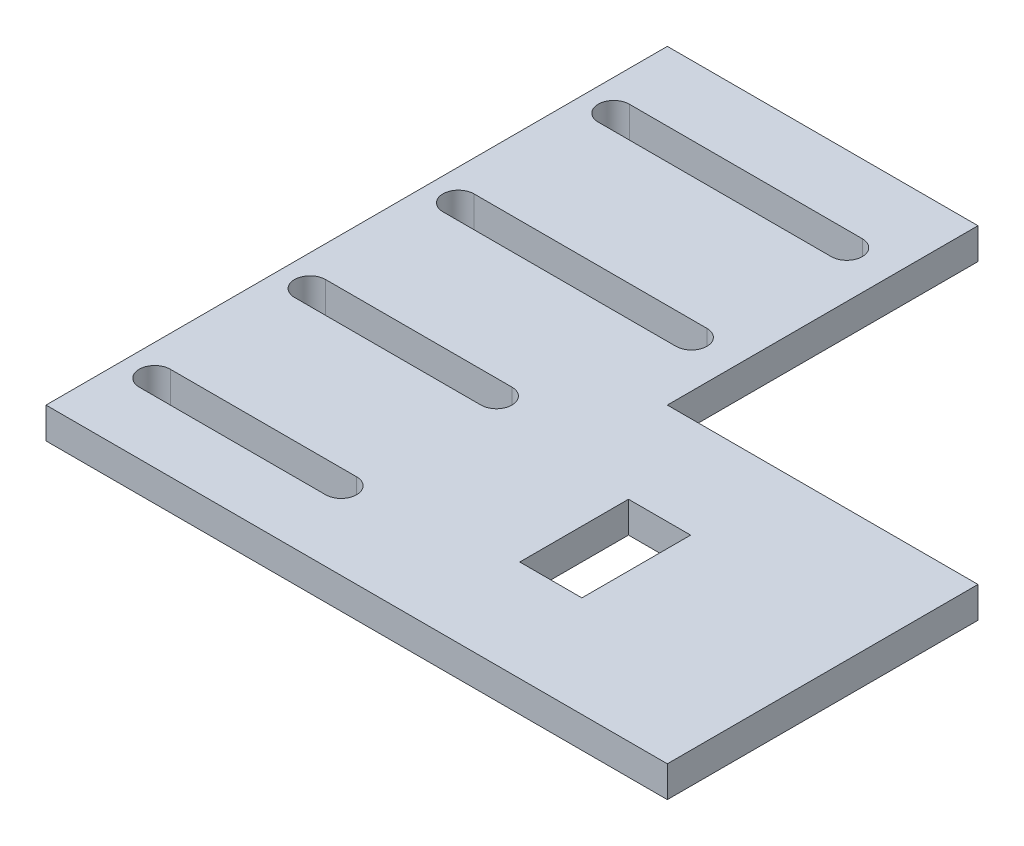
ISO-10303-21;
HEADER;
FILE_DESCRIPTION(('STEP AP214'),'2;1');
FILE_NAME('part.step','',(''),(''),'','','');
FILE_SCHEMA(('AUTOMOTIVE_DESIGN { 1 0 10303 214 1 1 1 1 }'));
ENDSEC;
DATA;
#1=APPLICATION_CONTEXT('core data for automotive mechanical design processes');
#2=APPLICATION_PROTOCOL_DEFINITION('international standard','automotive_design',2000,#1);
#3=PRODUCT_CONTEXT('',#1,'mechanical');
#4=PRODUCT('Part','Part','',(#3));
#5=PRODUCT_RELATED_PRODUCT_CATEGORY('part','',(#4));
#6=PRODUCT_DEFINITION_FORMATION('','',#4);
#7=PRODUCT_DEFINITION_CONTEXT('part definition',#1,'design');
#8=PRODUCT_DEFINITION('design','',#6,#7);
#9=PRODUCT_DEFINITION_SHAPE('','',#8);
#10=(LENGTH_UNIT() NAMED_UNIT(*) SI_UNIT(.MILLI.,.METRE.));
#11=(NAMED_UNIT(*) PLANE_ANGLE_UNIT() SI_UNIT($,.RADIAN.));
#12=(NAMED_UNIT(*) SI_UNIT($,.STERADIAN.) SOLID_ANGLE_UNIT());
#13=UNCERTAINTY_MEASURE_WITH_UNIT(LENGTH_MEASURE(1.E-05),#10,'distance_accuracy_value','');
#14=(GEOMETRIC_REPRESENTATION_CONTEXT(3) GLOBAL_UNCERTAINTY_ASSIGNED_CONTEXT((#13)) GLOBAL_UNIT_ASSIGNED_CONTEXT((#10,
#11,#12)) REPRESENTATION_CONTEXT('',''));
#15=CARTESIAN_POINT('',(0.,0.,0.));
#16=DIRECTION('',(0.,0.,1.));
#17=DIRECTION('',(1.,0.,0.));
#18=AXIS2_PLACEMENT_3D('',#15,#16,#17);
#19=CARTESIAN_POINT('',(50.,5.,-25.));
#20=DIRECTION('',(-1.,0.,0.));
#21=DIRECTION('',(0.,0.,1.));
#22=AXIS2_PLACEMENT_3D('',#19,#20,#21);
#23=PLANE('',#22);
#24=DIRECTION('',(0.,0.,-1.));
#25=VECTOR('',#24,1.);
#26=CARTESIAN_POINT('',(50.,0.,-25.));
#27=LINE('',#26,#25);
#28=CARTESIAN_POINT('',(50.,0.,25.));
#29=VERTEX_POINT('',#28);
#30=CARTESIAN_POINT('',(50.,0.,-25.));
#31=VERTEX_POINT('',#30);
#32=EDGE_CURVE('E381',#29,#31,#27,.T.);
#33=ORIENTED_EDGE('',*,*,#32,.T.);
#34=DIRECTION('',(0.,-1.,0.));
#35=VECTOR('',#34,1.);
#36=CARTESIAN_POINT('',(50.,5.,-25.));
#37=LINE('',#36,#35);
#38=CARTESIAN_POINT('',(50.,5.,-25.));
#39=VERTEX_POINT('',#38);
#40=EDGE_CURVE('E426',#39,#31,#37,.T.);
#41=ORIENTED_EDGE('',*,*,#40,.F.);
#42=DIRECTION('',(0.,0.,-1.));
#43=VECTOR('',#42,1.);
#44=CARTESIAN_POINT('',(50.,5.,-25.));
#45=LINE('',#44,#43);
#46=CARTESIAN_POINT('',(50.,5.,25.));
#47=VERTEX_POINT('',#46);
#48=EDGE_CURVE('E391',#47,#39,#45,.T.);
#49=ORIENTED_EDGE('',*,*,#48,.F.);
#50=DIRECTION('',(0.,-1.,0.));
#51=VECTOR('',#50,1.);
#52=CARTESIAN_POINT('',(50.,5.,25.));
#53=LINE('',#52,#51);
#54=EDGE_CURVE('E406',#47,#29,#53,.T.);
#55=ORIENTED_EDGE('',*,*,#54,.T.);
#56=EDGE_LOOP('',(#33,#41,#49,#55));
#57=FACE_BOUND('',#56,.T.);
#58=ADVANCED_FACE('F45',(#57),#23,.F.);
#59=CARTESIAN_POINT('',(-50.,5.,-25.));
#60=DIRECTION('',(0.,0.,1.));
#61=DIRECTION('',(1.,0.,0.));
#62=AXIS2_PLACEMENT_3D('',#59,#60,#61);
#63=PLANE('',#62);
#64=DIRECTION('',(-1.,0.,0.));
#65=VECTOR('',#64,1.);
#66=CARTESIAN_POINT('',(-50.,0.,-25.));
#67=LINE('',#66,#65);
#68=CARTESIAN_POINT('',(0.,0.,-25.));
#69=VERTEX_POINT('',#68);
#70=EDGE_CURVE('E410',#31,#69,#67,.T.);
#71=ORIENTED_EDGE('',*,*,#70,.T.);
#72=DIRECTION('',(0.,1.,0.));
#73=VECTOR('',#72,1.);
#74=CARTESIAN_POINT('',(0.,-70.7106781186548,-25.));
#75=LINE('',#74,#73);
#76=CARTESIAN_POINT('',(0.,5.,-25.));
#77=VERTEX_POINT('',#76);
#78=EDGE_CURVE('E294',#69,#77,#75,.T.);
#79=ORIENTED_EDGE('',*,*,#78,.T.);
#80=DIRECTION('',(-1.,0.,0.));
#81=VECTOR('',#80,1.);
#82=CARTESIAN_POINT('',(-50.,5.,-25.));
#83=LINE('',#82,#81);
#84=EDGE_CURVE('E395',#39,#77,#83,.T.);
#85=ORIENTED_EDGE('',*,*,#84,.F.);
#86=ORIENTED_EDGE('',*,*,#40,.T.);
#87=EDGE_LOOP('',(#71,#79,#85,#86));
#88=FACE_BOUND('',#87,.T.);
#89=ADVANCED_FACE('F522',(#88),#63,.F.);
#90=CARTESIAN_POINT('',(-50.,5.,-25.));
#91=DIRECTION('',(1.,0.,0.));
#92=DIRECTION('',(0.,0.,-1.));
#93=AXIS2_PLACEMENT_3D('',#90,#91,#92);
#94=PLANE('',#93);
#95=DIRECTION('',(0.,0.,1.));
#96=VECTOR('',#95,1.);
#97=CARTESIAN_POINT('',(-50.,0.,-25.));
#98=LINE('',#97,#96);
#99=CARTESIAN_POINT('',(-50.,0.,-75.));
#100=VERTEX_POINT('',#99);
#101=CARTESIAN_POINT('',(-50.,0.,25.));
#102=VERTEX_POINT('',#101);
#103=EDGE_CURVE('E414',#100,#102,#98,.T.);
#104=ORIENTED_EDGE('',*,*,#103,.T.);
#105=DIRECTION('',(0.,-1.,0.));
#106=VECTOR('',#105,1.);
#107=CARTESIAN_POINT('',(-50.,5.,25.));
#108=LINE('',#107,#106);
#109=CARTESIAN_POINT('',(-50.,5.,25.));
#110=VERTEX_POINT('',#109);
#111=EDGE_CURVE('E422',#110,#102,#108,.T.);
#112=ORIENTED_EDGE('',*,*,#111,.F.);
#113=DIRECTION('',(0.,0.,1.));
#114=VECTOR('',#113,1.);
#115=CARTESIAN_POINT('',(-50.,5.,-25.));
#116=LINE('',#115,#114);
#117=CARTESIAN_POINT('',(-50.,5.,-75.));
#118=VERTEX_POINT('',#117);
#119=EDGE_CURVE('E400',#118,#110,#116,.T.);
#120=ORIENTED_EDGE('',*,*,#119,.F.);
#121=DIRECTION('',(0.,1.,0.));
#122=VECTOR('',#121,1.);
#123=CARTESIAN_POINT('',(-50.,-70.7106781186548,-75.));
#124=LINE('',#123,#122);
#125=EDGE_CURVE('E286',#100,#118,#124,.T.);
#126=ORIENTED_EDGE('',*,*,#125,.F.);
#127=EDGE_LOOP('',(#104,#112,#120,#126));
#128=FACE_BOUND('',#127,.T.);
#129=ADVANCED_FACE('F528',(#128),#94,.F.);
#130=CARTESIAN_POINT('',(-50.,5.,25.));
#131=DIRECTION('',(0.,0.,-1.));
#132=DIRECTION('',(-1.,0.,0.));
#133=AXIS2_PLACEMENT_3D('',#130,#131,#132);
#134=PLANE('',#133);
#135=DIRECTION('',(1.,0.,0.));
#136=VECTOR('',#135,1.);
#137=CARTESIAN_POINT('',(-50.,0.,25.));
#138=LINE('',#137,#136);
#139=EDGE_CURVE('E396',#102,#29,#138,.T.);
#140=ORIENTED_EDGE('',*,*,#139,.T.);
#141=ORIENTED_EDGE('',*,*,#54,.F.);
#142=DIRECTION('',(1.,0.,0.));
#143=VECTOR('',#142,1.);
#144=CARTESIAN_POINT('',(-50.,5.,25.));
#145=LINE('',#144,#143);
#146=EDGE_CURVE('E403',#110,#47,#145,.T.);
#147=ORIENTED_EDGE('',*,*,#146,.F.);
#148=ORIENTED_EDGE('',*,*,#111,.T.);
#149=EDGE_LOOP('',(#140,#141,#147,#148));
#150=FACE_BOUND('',#149,.T.);
#151=ADVANCED_FACE('F542',(#150),#134,.F.);
#152=CARTESIAN_POINT('',(0.,5.,0.));
#153=DIRECTION('',(0.,1.,0.));
#154=DIRECTION('',(0.,0.,1.));
#155=AXIS2_PLACEMENT_3D('',#152,#153,#154);
#156=PLANE('',#155);
#157=CARTESIAN_POINT('',(-45.,5.,-61.380259693878));
#158=DIRECTION('',(0.,1.,0.));
#159=DIRECTION('',(0.,0.,1.));
#160=AXIS2_PLACEMENT_3D('',#157,#158,#159);
#161=CIRCLE('',#160,2.5);
#162=CARTESIAN_POINT('',(-45.,5.,-63.880259693878));
#163=VERTEX_POINT('',#162);
#164=CARTESIAN_POINT('',(-45.,5.,-58.880259693878));
#165=VERTEX_POINT('',#164);
#166=EDGE_CURVE('E60',#163,#165,#161,.T.);
#167=ORIENTED_EDGE('',*,*,#166,.F.);
#168=DIRECTION('',(-1.,0.,0.));
#169=VECTOR('',#168,1.);
#170=CARTESIAN_POINT('',(-45.,5.,-63.880259693878));
#171=LINE('',#170,#169);
#172=CARTESIAN_POINT('',(-7.5,5.,-63.880259693878));
#173=VERTEX_POINT('',#172);
#174=EDGE_CURVE('E239',#173,#163,#171,.T.);
#175=ORIENTED_EDGE('',*,*,#174,.F.);
#176=CARTESIAN_POINT('',(-7.5,5.,-61.380259693878));
#177=DIRECTION('',(0.,1.,0.));
#178=DIRECTION('',(0.,0.,1.));
#179=AXIS2_PLACEMENT_3D('',#176,#177,#178);
#180=CIRCLE('',#179,2.5);
#181=CARTESIAN_POINT('',(-7.5,5.,-58.880259693878));
#182=VERTEX_POINT('',#181);
#183=EDGE_CURVE('E221',#182,#173,#180,.T.);
#184=ORIENTED_EDGE('',*,*,#183,.F.);
#185=DIRECTION('',(1.,0.,0.));
#186=VECTOR('',#185,1.);
#187=CARTESIAN_POINT('',(-45.,5.,-58.880259693878));
#188=LINE('',#187,#186);
#189=EDGE_CURVE('E231',#165,#182,#188,.T.);
#190=ORIENTED_EDGE('',*,*,#189,.F.);
#191=EDGE_LOOP('',(#167,#175,#184,#190));
#192=FACE_BOUND('',#191,.T.);
#193=CARTESIAN_POINT('',(-45.,5.,-36.380259693878));
#194=DIRECTION('',(0.,1.,0.));
#195=DIRECTION('',(0.,0.,1.));
#196=AXIS2_PLACEMENT_3D('',#193,#194,#195);
#197=CIRCLE('',#196,2.5);
#198=CARTESIAN_POINT('',(-45.,5.,-38.880259693878));
#199=VERTEX_POINT('',#198);
#200=CARTESIAN_POINT('',(-45.,5.,-33.880259693878));
#201=VERTEX_POINT('',#200);
#202=EDGE_CURVE('E249',#199,#201,#197,.T.);
#203=ORIENTED_EDGE('',*,*,#202,.F.);
#204=DIRECTION('',(-1.,0.,0.));
#205=VECTOR('',#204,1.);
#206=CARTESIAN_POINT('',(-45.,5.,-38.880259693878));
#207=LINE('',#206,#205);
#208=CARTESIAN_POINT('',(-7.5,5.,-38.880259693878));
#209=VERTEX_POINT('',#208);
#210=EDGE_CURVE('E264',#209,#199,#207,.T.);
#211=ORIENTED_EDGE('',*,*,#210,.F.);
#212=CARTESIAN_POINT('',(-7.5,5.,-36.380259693878));
#213=DIRECTION('',(0.,1.,0.));
#214=DIRECTION('',(0.,0.,1.));
#215=AXIS2_PLACEMENT_3D('',#212,#213,#214);
#216=CIRCLE('',#215,2.5);
#217=CARTESIAN_POINT('',(-7.5,5.,-33.880259693878));
#218=VERTEX_POINT('',#217);
#219=EDGE_CURVE('E260',#218,#209,#216,.T.);
#220=ORIENTED_EDGE('',*,*,#219,.F.);
#221=DIRECTION('',(1.,0.,0.));
#222=VECTOR('',#221,1.);
#223=CARTESIAN_POINT('',(-45.,5.,-33.880259693878));
#224=LINE('',#223,#222);
#225=EDGE_CURVE('E256',#201,#218,#224,.T.);
#226=ORIENTED_EDGE('',*,*,#225,.F.);
#227=EDGE_LOOP('',(#203,#211,#220,#226));
#228=FACE_BOUND('',#227,.T.);
#229=CARTESIAN_POINT('',(-45.,5.,-12.5));
#230=DIRECTION('',(0.,1.,0.));
#231=DIRECTION('',(0.,0.,1.));
#232=AXIS2_PLACEMENT_3D('',#229,#230,#231);
#233=CIRCLE('',#232,2.5);
#234=CARTESIAN_POINT('',(-45.,5.,-15.));
#235=VERTEX_POINT('',#234);
#236=CARTESIAN_POINT('',(-45.,5.,-10.));
#237=VERTEX_POINT('',#236);
#238=EDGE_CURVE('E307',#235,#237,#233,.T.);
#239=ORIENTED_EDGE('',*,*,#238,.F.);
#240=DIRECTION('',(-1.,0.,0.));
#241=VECTOR('',#240,1.);
#242=CARTESIAN_POINT('',(-45.,5.,-15.));
#243=LINE('',#242,#241);
#244=CARTESIAN_POINT('',(-15.,5.,-15.));
#245=VERTEX_POINT('',#244);
#246=EDGE_CURVE('E319',#245,#235,#243,.T.);
#247=ORIENTED_EDGE('',*,*,#246,.F.);
#248=CARTESIAN_POINT('',(-15.,5.,-12.5));
#249=DIRECTION('',(0.,1.,0.));
#250=DIRECTION('',(0.,0.,1.));
#251=AXIS2_PLACEMENT_3D('',#248,#249,#250);
#252=CIRCLE('',#251,2.50000000000001);
#253=CARTESIAN_POINT('',(-15.,5.,-10.));
#254=VERTEX_POINT('',#253);
#255=EDGE_CURVE('E315',#254,#245,#252,.T.);
#256=ORIENTED_EDGE('',*,*,#255,.F.);
#257=DIRECTION('',(1.,0.,0.));
#258=VECTOR('',#257,1.);
#259=CARTESIAN_POINT('',(-45.,5.,-10.));
#260=LINE('',#259,#258);
#261=EDGE_CURVE('E310',#237,#254,#260,.T.);
#262=ORIENTED_EDGE('',*,*,#261,.F.);
#263=EDGE_LOOP('',(#239,#247,#256,#262));
#264=FACE_BOUND('',#263,.T.);
#265=CARTESIAN_POINT('',(-45.,5.,12.5));
#266=DIRECTION('',(0.,1.,0.));
#267=DIRECTION('',(0.,0.,1.));
#268=AXIS2_PLACEMENT_3D('',#265,#266,#267);
#269=CIRCLE('',#268,2.5);
#270=CARTESIAN_POINT('',(-45.,5.,9.99999999999999));
#271=VERTEX_POINT('',#270);
#272=CARTESIAN_POINT('',(-45.,5.,15.));
#273=VERTEX_POINT('',#272);
#274=EDGE_CURVE('E311',#271,#273,#269,.T.);
#275=ORIENTED_EDGE('',*,*,#274,.F.);
#276=DIRECTION('',(-1.,0.,0.));
#277=VECTOR('',#276,1.);
#278=CARTESIAN_POINT('',(-45.,5.,9.99999999999999));
#279=LINE('',#278,#277);
#280=CARTESIAN_POINT('',(-15.,5.,9.99999999999999));
#281=VERTEX_POINT('',#280);
#282=EDGE_CURVE('E341',#281,#271,#279,.T.);
#283=ORIENTED_EDGE('',*,*,#282,.F.);
#284=CARTESIAN_POINT('',(-15.,5.,12.5));
#285=DIRECTION('',(0.,1.,0.));
#286=DIRECTION('',(0.,0.,1.));
#287=AXIS2_PLACEMENT_3D('',#284,#285,#286);
#288=CIRCLE('',#287,2.50000000000001);
#289=CARTESIAN_POINT('',(-15.,5.,15.));
#290=VERTEX_POINT('',#289);
#291=EDGE_CURVE('E353',#290,#281,#288,.T.);
#292=ORIENTED_EDGE('',*,*,#291,.F.);
#293=DIRECTION('',(1.,0.,0.));
#294=VECTOR('',#293,1.);
#295=CARTESIAN_POINT('',(-45.,5.,15.));
#296=LINE('',#295,#294);
#297=EDGE_CURVE('E357',#273,#290,#296,.T.);
#298=ORIENTED_EDGE('',*,*,#297,.F.);
#299=EDGE_LOOP('',(#275,#283,#292,#298));
#300=FACE_BOUND('',#299,.T.);
#301=DIRECTION('',(0.,0.,-1.));
#302=VECTOR('',#301,1.);
#303=CARTESIAN_POINT('',(20.,5.,-8.75));
#304=LINE('',#303,#302);
#305=CARTESIAN_POINT('',(20.,5.,8.75));
#306=VERTEX_POINT('',#305);
#307=CARTESIAN_POINT('',(20.,5.,-8.75));
#308=VERTEX_POINT('',#307);
#309=EDGE_CURVE('E327',#306,#308,#304,.T.);
#310=ORIENTED_EDGE('',*,*,#309,.F.);
#311=DIRECTION('',(1.,0.,0.));
#312=VECTOR('',#311,1.);
#313=CARTESIAN_POINT('',(10.,5.,8.75));
#314=LINE('',#313,#312);
#315=CARTESIAN_POINT('',(10.,5.,8.75));
#316=VERTEX_POINT('',#315);
#317=EDGE_CURVE('E373',#316,#306,#314,.T.);
#318=ORIENTED_EDGE('',*,*,#317,.F.);
#319=DIRECTION('',(0.,0.,1.));
#320=VECTOR('',#319,1.);
#321=CARTESIAN_POINT('',(10.,5.,-8.75));
#322=LINE('',#321,#320);
#323=CARTESIAN_POINT('',(10.,5.,-8.75));
#324=VERTEX_POINT('',#323);
#325=EDGE_CURVE('E369',#324,#316,#322,.T.);
#326=ORIENTED_EDGE('',*,*,#325,.F.);
#327=DIRECTION('',(-1.,0.,0.));
#328=VECTOR('',#327,1.);
#329=CARTESIAN_POINT('',(10.,5.,-8.75));
#330=LINE('',#329,#328);
#331=EDGE_CURVE('E365',#308,#324,#330,.T.);
#332=ORIENTED_EDGE('',*,*,#331,.F.);
#333=EDGE_LOOP('',(#310,#318,#326,#332));
#334=FACE_BOUND('',#333,.T.);
#335=ORIENTED_EDGE('',*,*,#48,.T.);
#336=ORIENTED_EDGE('',*,*,#84,.T.);
#337=DIRECTION('',(0.,0.,-1.));
#338=VECTOR('',#337,1.);
#339=CARTESIAN_POINT('',(0.,5.,-75.));
#340=LINE('',#339,#338);
#341=CARTESIAN_POINT('',(0.,5.,-75.));
#342=VERTEX_POINT('',#341);
#343=EDGE_CURVE('E272',#77,#342,#340,.T.);
#344=ORIENTED_EDGE('',*,*,#343,.T.);
#345=DIRECTION('',(-1.,0.,0.));
#346=VECTOR('',#345,1.);
#347=CARTESIAN_POINT('',(-50.,5.,-75.));
#348=LINE('',#347,#346);
#349=EDGE_CURVE('E290',#342,#118,#348,.T.);
#350=ORIENTED_EDGE('',*,*,#349,.T.);
#351=ORIENTED_EDGE('',*,*,#119,.T.);
#352=ORIENTED_EDGE('',*,*,#146,.T.);
#353=EDGE_LOOP('',(#335,#336,#344,#350,#351,#352));
#354=FACE_BOUND('',#353,.T.);
#355=ADVANCED_FACE('F236',(#192,#228,#264,#300,#334,#354),#156,.T.);
#356=CARTESIAN_POINT('',(0.,0.,0.));
#357=DIRECTION('',(0.,1.,0.));
#358=DIRECTION('',(0.,0.,1.));
#359=AXIS2_PLACEMENT_3D('',#356,#357,#358);
#360=PLANE('',#359);
#361=DIRECTION('',(-1.,0.,0.));
#362=VECTOR('',#361,1.);
#363=CARTESIAN_POINT('',(0.,0.,-63.880259693878));
#364=LINE('',#363,#362);
#365=CARTESIAN_POINT('',(-7.5,0.,-63.880259693878));
#366=VERTEX_POINT('',#365);
#367=CARTESIAN_POINT('',(-45.,0.,-63.880259693878));
#368=VERTEX_POINT('',#367);
#369=EDGE_CURVE('E53',#366,#368,#364,.T.);
#370=ORIENTED_EDGE('',*,*,#369,.T.);
#371=CARTESIAN_POINT('',(-45.,0.,-61.380259693878));
#372=DIRECTION('',(0.,1.,0.));
#373=DIRECTION('',(0.,0.,1.));
#374=AXIS2_PLACEMENT_3D('',#371,#372,#373);
#375=CIRCLE('',#374,2.5);
#376=CARTESIAN_POINT('',(-45.,0.,-58.880259693878));
#377=VERTEX_POINT('',#376);
#378=EDGE_CURVE('E11',#368,#377,#375,.T.);
#379=ORIENTED_EDGE('',*,*,#378,.T.);
#380=DIRECTION('',(1.,0.,0.));
#381=VECTOR('',#380,1.);
#382=CARTESIAN_POINT('',(0.,0.,-58.880259693878));
#383=LINE('',#382,#381);
#384=CARTESIAN_POINT('',(-7.5,0.,-58.880259693878));
#385=VERTEX_POINT('',#384);
#386=EDGE_CURVE('E494',#377,#385,#383,.T.);
#387=ORIENTED_EDGE('',*,*,#386,.T.);
#388=CARTESIAN_POINT('',(-7.5,0.,-61.380259693878));
#389=DIRECTION('',(0.,1.,0.));
#390=DIRECTION('',(0.,0.,1.));
#391=AXIS2_PLACEMENT_3D('',#388,#389,#390);
#392=CIRCLE('',#391,2.5);
#393=EDGE_CURVE('E224',#385,#366,#392,.T.);
#394=ORIENTED_EDGE('',*,*,#393,.T.);
#395=EDGE_LOOP('',(#370,#379,#387,#394));
#396=FACE_BOUND('',#395,.T.);
#397=DIRECTION('',(-1.,0.,0.));
#398=VECTOR('',#397,1.);
#399=CARTESIAN_POINT('',(0.,0.,-38.880259693878));
#400=LINE('',#399,#398);
#401=CARTESIAN_POINT('',(-7.5,0.,-38.880259693878));
#402=VERTEX_POINT('',#401);
#403=CARTESIAN_POINT('',(-45.,0.,-38.880259693878));
#404=VERTEX_POINT('',#403);
#405=EDGE_CURVE('E486',#402,#404,#400,.T.);
#406=ORIENTED_EDGE('',*,*,#405,.T.);
#407=CARTESIAN_POINT('',(-45.,0.,-36.380259693878));
#408=DIRECTION('',(0.,1.,0.));
#409=DIRECTION('',(0.,0.,1.));
#410=AXIS2_PLACEMENT_3D('',#407,#408,#409);
#411=CIRCLE('',#410,2.5);
#412=CARTESIAN_POINT('',(-45.,0.,-33.880259693878));
#413=VERTEX_POINT('',#412);
#414=EDGE_CURVE('E490',#404,#413,#411,.T.);
#415=ORIENTED_EDGE('',*,*,#414,.T.);
#416=DIRECTION('',(1.,0.,0.));
#417=VECTOR('',#416,1.);
#418=CARTESIAN_POINT('',(0.,0.,-33.880259693878));
#419=LINE('',#418,#417);
#420=CARTESIAN_POINT('',(-7.5,0.,-33.880259693878));
#421=VERTEX_POINT('',#420);
#422=EDGE_CURVE('E478',#413,#421,#419,.T.);
#423=ORIENTED_EDGE('',*,*,#422,.T.);
#424=CARTESIAN_POINT('',(-7.5,0.,-36.380259693878));
#425=DIRECTION('',(0.,1.,0.));
#426=DIRECTION('',(0.,0.,1.));
#427=AXIS2_PLACEMENT_3D('',#424,#425,#426);
#428=CIRCLE('',#427,2.5);
#429=EDGE_CURVE('E482',#421,#402,#428,.T.);
#430=ORIENTED_EDGE('',*,*,#429,.T.);
#431=EDGE_LOOP('',(#406,#415,#423,#430));
#432=FACE_BOUND('',#431,.T.);
#433=DIRECTION('',(-1.,0.,0.));
#434=VECTOR('',#433,1.);
#435=CARTESIAN_POINT('',(0.,0.,-15.));
#436=LINE('',#435,#434);
#437=CARTESIAN_POINT('',(-15.,0.,-15.));
#438=VERTEX_POINT('',#437);
#439=CARTESIAN_POINT('',(-45.,0.,-15.));
#440=VERTEX_POINT('',#439);
#441=EDGE_CURVE('E470',#438,#440,#436,.T.);
#442=ORIENTED_EDGE('',*,*,#441,.T.);
#443=CARTESIAN_POINT('',(-45.,0.,-12.5));
#444=DIRECTION('',(0.,1.,0.));
#445=DIRECTION('',(0.,0.,1.));
#446=AXIS2_PLACEMENT_3D('',#443,#444,#445);
#447=CIRCLE('',#446,2.5);
#448=CARTESIAN_POINT('',(-45.,0.,-10.));
#449=VERTEX_POINT('',#448);
#450=EDGE_CURVE('E474',#440,#449,#447,.T.);
#451=ORIENTED_EDGE('',*,*,#450,.T.);
#452=DIRECTION('',(1.,0.,0.));
#453=VECTOR('',#452,1.);
#454=CARTESIAN_POINT('',(0.,0.,-10.));
#455=LINE('',#454,#453);
#456=CARTESIAN_POINT('',(-15.,0.,-10.));
#457=VERTEX_POINT('',#456);
#458=EDGE_CURVE('E462',#449,#457,#455,.T.);
#459=ORIENTED_EDGE('',*,*,#458,.T.);
#460=CARTESIAN_POINT('',(-15.,0.,-12.5));
#461=DIRECTION('',(0.,1.,0.));
#462=DIRECTION('',(0.,0.,1.));
#463=AXIS2_PLACEMENT_3D('',#460,#461,#462);
#464=CIRCLE('',#463,2.50000000000001);
#465=EDGE_CURVE('E466',#457,#438,#464,.T.);
#466=ORIENTED_EDGE('',*,*,#465,.T.);
#467=EDGE_LOOP('',(#442,#451,#459,#466));
#468=FACE_BOUND('',#467,.T.);
#469=DIRECTION('',(-1.,0.,0.));
#470=VECTOR('',#469,1.);
#471=CARTESIAN_POINT('',(0.,0.,9.99999999999998));
#472=LINE('',#471,#470);
#473=CARTESIAN_POINT('',(-15.,0.,9.99999999999999));
#474=VERTEX_POINT('',#473);
#475=CARTESIAN_POINT('',(-45.,0.,9.99999999999999));
#476=VERTEX_POINT('',#475);
#477=EDGE_CURVE('E454',#474,#476,#472,.T.);
#478=ORIENTED_EDGE('',*,*,#477,.T.);
#479=CARTESIAN_POINT('',(-45.,0.,12.5));
#480=DIRECTION('',(0.,1.,0.));
#481=DIRECTION('',(0.,0.,1.));
#482=AXIS2_PLACEMENT_3D('',#479,#480,#481);
#483=CIRCLE('',#482,2.5);
#484=CARTESIAN_POINT('',(-45.,0.,15.));
#485=VERTEX_POINT('',#484);
#486=EDGE_CURVE('E458',#476,#485,#483,.T.);
#487=ORIENTED_EDGE('',*,*,#486,.T.);
#488=DIRECTION('',(1.,0.,0.));
#489=VECTOR('',#488,1.);
#490=CARTESIAN_POINT('',(0.,0.,15.));
#491=LINE('',#490,#489);
#492=CARTESIAN_POINT('',(-15.,0.,15.));
#493=VERTEX_POINT('',#492);
#494=EDGE_CURVE('E446',#485,#493,#491,.T.);
#495=ORIENTED_EDGE('',*,*,#494,.T.);
#496=CARTESIAN_POINT('',(-15.,0.,12.5));
#497=DIRECTION('',(0.,1.,0.));
#498=DIRECTION('',(0.,0.,1.));
#499=AXIS2_PLACEMENT_3D('',#496,#497,#498);
#500=CIRCLE('',#499,2.50000000000001);
#501=EDGE_CURVE('E450',#493,#474,#500,.T.);
#502=ORIENTED_EDGE('',*,*,#501,.T.);
#503=EDGE_LOOP('',(#478,#487,#495,#502));
#504=FACE_BOUND('',#503,.T.);
#505=DIRECTION('',(1.,0.,0.));
#506=VECTOR('',#505,1.);
#507=CARTESIAN_POINT('',(0.,0.,8.75));
#508=LINE('',#507,#506);
#509=CARTESIAN_POINT('',(10.,0.,8.75));
#510=VERTEX_POINT('',#509);
#511=CARTESIAN_POINT('',(20.,0.,8.75));
#512=VERTEX_POINT('',#511);
#513=EDGE_CURVE('E438',#510,#512,#508,.T.);
#514=ORIENTED_EDGE('',*,*,#513,.T.);
#515=DIRECTION('',(0.,0.,-1.));
#516=VECTOR('',#515,1.);
#517=CARTESIAN_POINT('',(20.,0.,0.));
#518=LINE('',#517,#516);
#519=CARTESIAN_POINT('',(20.,0.,-8.75));
#520=VERTEX_POINT('',#519);
#521=EDGE_CURVE('E442',#512,#520,#518,.T.);
#522=ORIENTED_EDGE('',*,*,#521,.T.);
#523=DIRECTION('',(-1.,0.,0.));
#524=VECTOR('',#523,1.);
#525=CARTESIAN_POINT('',(0.,0.,-8.75));
#526=LINE('',#525,#524);
#527=CARTESIAN_POINT('',(10.,0.,-8.75));
#528=VERTEX_POINT('',#527);
#529=EDGE_CURVE('E430',#520,#528,#526,.T.);
#530=ORIENTED_EDGE('',*,*,#529,.T.);
#531=DIRECTION('',(0.,0.,1.));
#532=VECTOR('',#531,1.);
#533=CARTESIAN_POINT('',(10.,0.,0.));
#534=LINE('',#533,#532);
#535=EDGE_CURVE('E434',#528,#510,#534,.T.);
#536=ORIENTED_EDGE('',*,*,#535,.T.);
#537=EDGE_LOOP('',(#514,#522,#530,#536));
#538=FACE_BOUND('',#537,.T.);
#539=ORIENTED_EDGE('',*,*,#32,.F.);
#540=ORIENTED_EDGE('',*,*,#139,.F.);
#541=ORIENTED_EDGE('',*,*,#103,.F.);
#542=DIRECTION('',(1.,0.,0.));
#543=VECTOR('',#542,1.);
#544=CARTESIAN_POINT('',(-50.,0.,-75.));
#545=LINE('',#544,#543);
#546=CARTESIAN_POINT('',(0.,0.,-75.));
#547=VERTEX_POINT('',#546);
#548=EDGE_CURVE('E282',#100,#547,#545,.T.);
#549=ORIENTED_EDGE('',*,*,#548,.T.);
#550=DIRECTION('',(0.,0.,1.));
#551=VECTOR('',#550,1.);
#552=CARTESIAN_POINT('',(0.,0.,-75.));
#553=LINE('',#552,#551);
#554=EDGE_CURVE('E285',#547,#69,#553,.T.);
#555=ORIENTED_EDGE('',*,*,#554,.T.);
#556=ORIENTED_EDGE('',*,*,#70,.F.);
#557=EDGE_LOOP('',(#539,#540,#541,#549,#555,#556));
#558=FACE_BOUND('',#557,.T.);
#559=ADVANCED_FACE('F501',(#396,#432,#468,#504,#538,#558),#360,.F.);
#560=CARTESIAN_POINT('',(20.,-2.5,-8.75));
#561=DIRECTION('',(1.,0.,0.));
#562=DIRECTION('',(0.,0.,-1.));
#563=AXIS2_PLACEMENT_3D('',#560,#561,#562);
#564=PLANE('',#563);
#565=DIRECTION('',(0.,1.,0.));
#566=VECTOR('',#565,1.);
#567=CARTESIAN_POINT('',(20.,-2.5,8.75));
#568=LINE('',#567,#566);
#569=EDGE_CURVE('E378',#512,#306,#568,.T.);
#570=ORIENTED_EDGE('',*,*,#569,.T.);
#571=ORIENTED_EDGE('',*,*,#309,.T.);
#572=DIRECTION('',(0.,1.,0.));
#573=VECTOR('',#572,1.);
#574=CARTESIAN_POINT('',(20.,-2.5,-8.75));
#575=LINE('',#574,#573);
#576=EDGE_CURVE('E377',#520,#308,#575,.T.);
#577=ORIENTED_EDGE('',*,*,#576,.F.);
#578=ORIENTED_EDGE('',*,*,#521,.F.);
#579=EDGE_LOOP('',(#570,#571,#577,#578));
#580=FACE_BOUND('',#579,.T.);
#581=ADVANCED_FACE('F601',(#580),#564,.F.);
#582=CARTESIAN_POINT('',(10.,-2.5,8.75));
#583=DIRECTION('',(0.,0.,1.));
#584=DIRECTION('',(1.,0.,0.));
#585=AXIS2_PLACEMENT_3D('',#582,#583,#584);
#586=PLANE('',#585);
#587=DIRECTION('',(0.,1.,0.));
#588=VECTOR('',#587,1.);
#589=CARTESIAN_POINT('',(10.,-2.5,8.75));
#590=LINE('',#589,#588);
#591=EDGE_CURVE('E382',#510,#316,#590,.T.);
#592=ORIENTED_EDGE('',*,*,#591,.T.);
#593=ORIENTED_EDGE('',*,*,#317,.T.);
#594=ORIENTED_EDGE('',*,*,#569,.F.);
#595=ORIENTED_EDGE('',*,*,#513,.F.);
#596=EDGE_LOOP('',(#592,#593,#594,#595));
#597=FACE_BOUND('',#596,.T.);
#598=ADVANCED_FACE('F597',(#597),#586,.F.);
#599=CARTESIAN_POINT('',(10.,-2.5,-8.75));
#600=DIRECTION('',(-1.,0.,0.));
#601=DIRECTION('',(0.,0.,1.));
#602=AXIS2_PLACEMENT_3D('',#599,#600,#601);
#603=PLANE('',#602);
#604=DIRECTION('',(0.,1.,0.));
#605=VECTOR('',#604,1.);
#606=CARTESIAN_POINT('',(10.,-2.5,-8.75));
#607=LINE('',#606,#605);
#608=EDGE_CURVE('E385',#528,#324,#607,.T.);
#609=ORIENTED_EDGE('',*,*,#608,.T.);
#610=ORIENTED_EDGE('',*,*,#325,.T.);
#611=ORIENTED_EDGE('',*,*,#591,.F.);
#612=ORIENTED_EDGE('',*,*,#535,.F.);
#613=EDGE_LOOP('',(#609,#610,#611,#612));
#614=FACE_BOUND('',#613,.T.);
#615=ADVANCED_FACE('F600',(#614),#603,.F.);
#616=CARTESIAN_POINT('',(10.,-2.5,-8.75));
#617=DIRECTION('',(0.,0.,-1.));
#618=DIRECTION('',(-1.,0.,0.));
#619=AXIS2_PLACEMENT_3D('',#616,#617,#618);
#620=PLANE('',#619);
#621=ORIENTED_EDGE('',*,*,#576,.T.);
#622=ORIENTED_EDGE('',*,*,#331,.T.);
#623=ORIENTED_EDGE('',*,*,#608,.F.);
#624=ORIENTED_EDGE('',*,*,#529,.F.);
#625=EDGE_LOOP('',(#621,#622,#623,#624));
#626=FACE_BOUND('',#625,.T.);
#627=ADVANCED_FACE('F585',(#626),#620,.F.);
#628=CARTESIAN_POINT('',(-45.,-2.5,12.5));
#629=DIRECTION('',(0.,1.,0.));
#630=DIRECTION('',(0.,0.,1.));
#631=AXIS2_PLACEMENT_3D('',#628,#629,#630);
#632=CYLINDRICAL_SURFACE('',#631,2.5);
#633=DIRECTION('',(0.,1.,0.));
#634=VECTOR('',#633,1.);
#635=CARTESIAN_POINT('',(-45.,-2.5,9.99999999999999));
#636=LINE('',#635,#634);
#637=EDGE_CURVE('E306',#476,#271,#636,.T.);
#638=ORIENTED_EDGE('',*,*,#637,.T.);
#639=ORIENTED_EDGE('',*,*,#274,.T.);
#640=DIRECTION('',(0.,1.,0.));
#641=VECTOR('',#640,1.);
#642=CARTESIAN_POINT('',(-45.,-2.5,15.));
#643=LINE('',#642,#641);
#644=EDGE_CURVE('E337',#485,#273,#643,.T.);
#645=ORIENTED_EDGE('',*,*,#644,.F.);
#646=ORIENTED_EDGE('',*,*,#486,.F.);
#647=EDGE_LOOP('',(#638,#639,#645,#646));
#648=FACE_BOUND('',#647,.T.);
#649=ADVANCED_FACE('F581',(#648),#632,.F.);
#650=CARTESIAN_POINT('',(-45.,-2.5,9.99999999999999));
#651=DIRECTION('',(0.,0.,-1.));
#652=DIRECTION('',(-1.,0.,0.));
#653=AXIS2_PLACEMENT_3D('',#650,#651,#652);
#654=PLANE('',#653);
#655=DIRECTION('',(0.,1.,0.));
#656=VECTOR('',#655,1.);
#657=CARTESIAN_POINT('',(-15.,-2.5,9.99999999999999));
#658=LINE('',#657,#656);
#659=EDGE_CURVE('E345',#474,#281,#658,.T.);
#660=ORIENTED_EDGE('',*,*,#659,.T.);
#661=ORIENTED_EDGE('',*,*,#282,.T.);
#662=ORIENTED_EDGE('',*,*,#637,.F.);
#663=ORIENTED_EDGE('',*,*,#477,.F.);
#664=EDGE_LOOP('',(#660,#661,#662,#663));
#665=FACE_BOUND('',#664,.T.);
#666=ADVANCED_FACE('F584',(#665),#654,.F.);
#667=CARTESIAN_POINT('',(-15.,-2.5,12.5));
#668=DIRECTION('',(0.,1.,0.));
#669=DIRECTION('',(0.,0.,1.));
#670=AXIS2_PLACEMENT_3D('',#667,#668,#669);
#671=CYLINDRICAL_SURFACE('',#670,2.50000000000001);
#672=DIRECTION('',(0.,1.,0.));
#673=VECTOR('',#672,1.);
#674=CARTESIAN_POINT('',(-15.,-2.5,15.));
#675=LINE('',#674,#673);
#676=EDGE_CURVE('E342',#493,#290,#675,.T.);
#677=ORIENTED_EDGE('',*,*,#676,.T.);
#678=ORIENTED_EDGE('',*,*,#291,.T.);
#679=ORIENTED_EDGE('',*,*,#659,.F.);
#680=ORIENTED_EDGE('',*,*,#501,.F.);
#681=EDGE_LOOP('',(#677,#678,#679,#680));
#682=FACE_BOUND('',#681,.T.);
#683=ADVANCED_FACE('F589',(#682),#671,.F.);
#684=CARTESIAN_POINT('',(-45.,-2.5,15.));
#685=DIRECTION('',(0.,0.,1.));
#686=DIRECTION('',(1.,0.,0.));
#687=AXIS2_PLACEMENT_3D('',#684,#685,#686);
#688=PLANE('',#687);
#689=ORIENTED_EDGE('',*,*,#644,.T.);
#690=ORIENTED_EDGE('',*,*,#297,.T.);
#691=ORIENTED_EDGE('',*,*,#676,.F.);
#692=ORIENTED_EDGE('',*,*,#494,.F.);
#693=EDGE_LOOP('',(#689,#690,#691,#692));
#694=FACE_BOUND('',#693,.T.);
#695=ADVANCED_FACE('F579',(#694),#688,.F.);
#696=CARTESIAN_POINT('',(-45.,-2.5,-12.5));
#697=DIRECTION('',(0.,1.,0.));
#698=DIRECTION('',(0.,0.,1.));
#699=AXIS2_PLACEMENT_3D('',#696,#697,#698);
#700=CYLINDRICAL_SURFACE('',#699,2.5);
#701=DIRECTION('',(0.,1.,0.));
#702=VECTOR('',#701,1.);
#703=CARTESIAN_POINT('',(-45.,-2.5,-15.));
#704=LINE('',#703,#702);
#705=EDGE_CURVE('E324',#440,#235,#704,.T.);
#706=ORIENTED_EDGE('',*,*,#705,.T.);
#707=ORIENTED_EDGE('',*,*,#238,.T.);
#708=DIRECTION('',(0.,1.,0.));
#709=VECTOR('',#708,1.);
#710=CARTESIAN_POINT('',(-45.,-2.5,-10.));
#711=LINE('',#710,#709);
#712=EDGE_CURVE('E323',#449,#237,#711,.T.);
#713=ORIENTED_EDGE('',*,*,#712,.F.);
#714=ORIENTED_EDGE('',*,*,#450,.F.);
#715=EDGE_LOOP('',(#706,#707,#713,#714));
#716=FACE_BOUND('',#715,.T.);
#717=ADVANCED_FACE('F569',(#716),#700,.F.);
#718=CARTESIAN_POINT('',(-45.,-2.5,-15.));
#719=DIRECTION('',(0.,0.,-1.));
#720=DIRECTION('',(-1.,0.,0.));
#721=AXIS2_PLACEMENT_3D('',#718,#719,#720);
#722=PLANE('',#721);
#723=DIRECTION('',(0.,1.,0.));
#724=VECTOR('',#723,1.);
#725=CARTESIAN_POINT('',(-15.,-2.5,-15.));
#726=LINE('',#725,#724);
#727=EDGE_CURVE('E328',#438,#245,#726,.T.);
#728=ORIENTED_EDGE('',*,*,#727,.T.);
#729=ORIENTED_EDGE('',*,*,#246,.T.);
#730=ORIENTED_EDGE('',*,*,#705,.F.);
#731=ORIENTED_EDGE('',*,*,#441,.F.);
#732=EDGE_LOOP('',(#728,#729,#730,#731));
#733=FACE_BOUND('',#732,.T.);
#734=ADVANCED_FACE('F565',(#733),#722,.F.);
#735=CARTESIAN_POINT('',(-15.,-2.5,-12.5));
#736=DIRECTION('',(0.,1.,0.));
#737=DIRECTION('',(0.,0.,1.));
#738=AXIS2_PLACEMENT_3D('',#735,#736,#737);
#739=CYLINDRICAL_SURFACE('',#738,2.50000000000001);
#740=DIRECTION('',(0.,1.,0.));
#741=VECTOR('',#740,1.);
#742=CARTESIAN_POINT('',(-15.,-2.5,-10.));
#743=LINE('',#742,#741);
#744=EDGE_CURVE('E331',#457,#254,#743,.T.);
#745=ORIENTED_EDGE('',*,*,#744,.T.);
#746=ORIENTED_EDGE('',*,*,#255,.T.);
#747=ORIENTED_EDGE('',*,*,#727,.F.);
#748=ORIENTED_EDGE('',*,*,#465,.F.);
#749=EDGE_LOOP('',(#745,#746,#747,#748));
#750=FACE_BOUND('',#749,.T.);
#751=ADVANCED_FACE('F568',(#750),#739,.F.);
#752=CARTESIAN_POINT('',(-45.,-2.5,-10.));
#753=DIRECTION('',(0.,0.,1.));
#754=DIRECTION('',(1.,0.,0.));
#755=AXIS2_PLACEMENT_3D('',#752,#753,#754);
#756=PLANE('',#755);
#757=ORIENTED_EDGE('',*,*,#712,.T.);
#758=ORIENTED_EDGE('',*,*,#261,.T.);
#759=ORIENTED_EDGE('',*,*,#744,.F.);
#760=ORIENTED_EDGE('',*,*,#458,.F.);
#761=EDGE_LOOP('',(#757,#758,#759,#760));
#762=FACE_BOUND('',#761,.T.);
#763=ADVANCED_FACE('F562',(#762),#756,.F.);
#764=CARTESIAN_POINT('',(-50.,-70.7106781186548,-75.));
#765=DIRECTION('',(0.,0.,-1.));
#766=DIRECTION('',(-1.,0.,0.));
#767=AXIS2_PLACEMENT_3D('',#764,#765,#766);
#768=PLANE('',#767);
#769=ORIENTED_EDGE('',*,*,#548,.F.);
#770=ORIENTED_EDGE('',*,*,#125,.T.);
#771=ORIENTED_EDGE('',*,*,#349,.F.);
#772=DIRECTION('',(0.,1.,0.));
#773=VECTOR('',#772,1.);
#774=CARTESIAN_POINT('',(0.,-70.7106781186548,-75.));
#775=LINE('',#774,#773);
#776=EDGE_CURVE('E298',#547,#342,#775,.T.);
#777=ORIENTED_EDGE('',*,*,#776,.F.);
#778=EDGE_LOOP('',(#769,#770,#771,#777));
#779=FACE_BOUND('',#778,.T.);
#780=ADVANCED_FACE('F548',(#779),#768,.T.);
#781=CARTESIAN_POINT('',(0.,-70.7106781186548,-75.));
#782=DIRECTION('',(1.,0.,0.));
#783=DIRECTION('',(0.,0.,-1.));
#784=AXIS2_PLACEMENT_3D('',#781,#782,#783);
#785=PLANE('',#784);
#786=ORIENTED_EDGE('',*,*,#554,.F.);
#787=ORIENTED_EDGE('',*,*,#776,.T.);
#788=ORIENTED_EDGE('',*,*,#343,.F.);
#789=ORIENTED_EDGE('',*,*,#78,.F.);
#790=EDGE_LOOP('',(#786,#787,#788,#789));
#791=FACE_BOUND('',#790,.T.);
#792=ADVANCED_FACE('F551',(#791),#785,.T.);
#793=CARTESIAN_POINT('',(-45.,-5.,-36.380259693878));
#794=DIRECTION('',(0.,1.,0.));
#795=DIRECTION('',(0.,0.,1.));
#796=AXIS2_PLACEMENT_3D('',#793,#794,#795);
#797=CYLINDRICAL_SURFACE('',#796,2.5);
#798=DIRECTION('',(0.,1.,0.));
#799=VECTOR('',#798,1.);
#800=CARTESIAN_POINT('',(-45.,-5.,-38.880259693878));
#801=LINE('',#800,#799);
#802=EDGE_CURVE('E269',#404,#199,#801,.T.);
#803=ORIENTED_EDGE('',*,*,#802,.T.);
#804=ORIENTED_EDGE('',*,*,#202,.T.);
#805=DIRECTION('',(0.,1.,0.));
#806=VECTOR('',#805,1.);
#807=CARTESIAN_POINT('',(-45.,-5.,-33.880259693878));
#808=LINE('',#807,#806);
#809=EDGE_CURVE('E268',#413,#201,#808,.T.);
#810=ORIENTED_EDGE('',*,*,#809,.F.);
#811=ORIENTED_EDGE('',*,*,#414,.F.);
#812=EDGE_LOOP('',(#803,#804,#810,#811));
#813=FACE_BOUND('',#812,.T.);
#814=ADVANCED_FACE('F553',(#813),#797,.F.);
#815=CARTESIAN_POINT('',(-45.,-5.,-38.880259693878));
#816=DIRECTION('',(0.,0.,-1.));
#817=DIRECTION('',(-1.,0.,0.));
#818=AXIS2_PLACEMENT_3D('',#815,#816,#817);
#819=PLANE('',#818);
#820=DIRECTION('',(0.,1.,0.));
#821=VECTOR('',#820,1.);
#822=CARTESIAN_POINT('',(-7.5,-5.,-38.880259693878));
#823=LINE('',#822,#821);
#824=EDGE_CURVE('E273',#402,#209,#823,.T.);
#825=ORIENTED_EDGE('',*,*,#824,.T.);
#826=ORIENTED_EDGE('',*,*,#210,.T.);
#827=ORIENTED_EDGE('',*,*,#802,.F.);
#828=ORIENTED_EDGE('',*,*,#405,.F.);
#829=EDGE_LOOP('',(#825,#826,#827,#828));
#830=FACE_BOUND('',#829,.T.);
#831=ADVANCED_FACE('F559',(#830),#819,.F.);
#832=CARTESIAN_POINT('',(-7.5,-5.,-36.380259693878));
#833=DIRECTION('',(0.,1.,0.));
#834=DIRECTION('',(0.,0.,1.));
#835=AXIS2_PLACEMENT_3D('',#832,#833,#834);
#836=CYLINDRICAL_SURFACE('',#835,2.5);
#837=DIRECTION('',(0.,1.,0.));
#838=VECTOR('',#837,1.);
#839=CARTESIAN_POINT('',(-7.5,-5.,-33.880259693878));
#840=LINE('',#839,#838);
#841=EDGE_CURVE('E276',#421,#218,#840,.T.);
#842=ORIENTED_EDGE('',*,*,#841,.T.);
#843=ORIENTED_EDGE('',*,*,#219,.T.);
#844=ORIENTED_EDGE('',*,*,#824,.F.);
#845=ORIENTED_EDGE('',*,*,#429,.F.);
#846=EDGE_LOOP('',(#842,#843,#844,#845));
#847=FACE_BOUND('',#846,.T.);
#848=ADVANCED_FACE('F516',(#847),#836,.F.);
#849=CARTESIAN_POINT('',(-45.,-5.,-33.880259693878));
#850=DIRECTION('',(0.,0.,1.));
#851=DIRECTION('',(1.,0.,0.));
#852=AXIS2_PLACEMENT_3D('',#849,#850,#851);
#853=PLANE('',#852);
#854=ORIENTED_EDGE('',*,*,#809,.T.);
#855=ORIENTED_EDGE('',*,*,#225,.T.);
#856=ORIENTED_EDGE('',*,*,#841,.F.);
#857=ORIENTED_EDGE('',*,*,#422,.F.);
#858=EDGE_LOOP('',(#854,#855,#856,#857));
#859=FACE_BOUND('',#858,.T.);
#860=ADVANCED_FACE('F508',(#859),#853,.F.);
#861=CARTESIAN_POINT('',(-45.,-5.,-61.380259693878));
#862=DIRECTION('',(0.,1.,0.));
#863=DIRECTION('',(0.,0.,1.));
#864=AXIS2_PLACEMENT_3D('',#861,#862,#863);
#865=CYLINDRICAL_SURFACE('',#864,2.5);
#866=DIRECTION('',(0.,1.,0.));
#867=VECTOR('',#866,1.);
#868=CARTESIAN_POINT('',(-45.,-5.,-63.880259693878));
#869=LINE('',#868,#867);
#870=EDGE_CURVE('E246',#368,#163,#869,.T.);
#871=ORIENTED_EDGE('',*,*,#870,.T.);
#872=ORIENTED_EDGE('',*,*,#166,.T.);
#873=DIRECTION('',(0.,1.,0.));
#874=VECTOR('',#873,1.);
#875=CARTESIAN_POINT('',(-45.,-5.,-58.880259693878));
#876=LINE('',#875,#874);
#877=EDGE_CURVE('E228',#377,#165,#876,.T.);
#878=ORIENTED_EDGE('',*,*,#877,.F.);
#879=ORIENTED_EDGE('',*,*,#378,.F.);
#880=EDGE_LOOP('',(#871,#872,#878,#879));
#881=FACE_BOUND('',#880,.T.);
#882=ADVANCED_FACE('F506',(#881),#865,.F.);
#883=CARTESIAN_POINT('',(-45.,-5.,-63.880259693878));
#884=DIRECTION('',(0.,0.,-1.));
#885=DIRECTION('',(-1.,0.,0.));
#886=AXIS2_PLACEMENT_3D('',#883,#884,#885);
#887=PLANE('',#886);
#888=DIRECTION('',(0.,1.,0.));
#889=VECTOR('',#888,1.);
#890=CARTESIAN_POINT('',(-7.5,-5.,-63.880259693878));
#891=LINE('',#890,#889);
#892=EDGE_CURVE('E227',#366,#173,#891,.T.);
#893=ORIENTED_EDGE('',*,*,#892,.T.);
#894=ORIENTED_EDGE('',*,*,#174,.T.);
#895=ORIENTED_EDGE('',*,*,#870,.F.);
#896=ORIENTED_EDGE('',*,*,#369,.F.);
#897=EDGE_LOOP('',(#893,#894,#895,#896));
#898=FACE_BOUND('',#897,.T.);
#899=ADVANCED_FACE('F505',(#898),#887,.F.);
#900=CARTESIAN_POINT('',(-7.5,-5.,-61.380259693878));
#901=DIRECTION('',(0.,1.,0.));
#902=DIRECTION('',(0.,0.,1.));
#903=AXIS2_PLACEMENT_3D('',#900,#901,#902);
#904=CYLINDRICAL_SURFACE('',#903,2.5);
#905=DIRECTION('',(0.,1.,0.));
#906=VECTOR('',#905,1.);
#907=CARTESIAN_POINT('',(-7.5,-5.,-58.880259693878));
#908=LINE('',#907,#906);
#909=EDGE_CURVE('E68',#385,#182,#908,.T.);
#910=ORIENTED_EDGE('',*,*,#909,.T.);
#911=ORIENTED_EDGE('',*,*,#183,.T.);
#912=ORIENTED_EDGE('',*,*,#892,.F.);
#913=ORIENTED_EDGE('',*,*,#393,.F.);
#914=EDGE_LOOP('',(#910,#911,#912,#913));
#915=FACE_BOUND('',#914,.T.);
#916=ADVANCED_FACE('F218',(#915),#904,.F.);
#917=CARTESIAN_POINT('',(-45.,-5.,-58.880259693878));
#918=DIRECTION('',(0.,0.,1.));
#919=DIRECTION('',(1.,0.,0.));
#920=AXIS2_PLACEMENT_3D('',#917,#918,#919);
#921=PLANE('',#920);
#922=ORIENTED_EDGE('',*,*,#877,.T.);
#923=ORIENTED_EDGE('',*,*,#189,.T.);
#924=ORIENTED_EDGE('',*,*,#909,.F.);
#925=ORIENTED_EDGE('',*,*,#386,.F.);
#926=EDGE_LOOP('',(#922,#923,#924,#925));
#927=FACE_BOUND('',#926,.T.);
#928=ADVANCED_FACE('F232',(#927),#921,.F.);
#929=CLOSED_SHELL('',(#58,#89,#129,#151,#355,#559,#581,#598,#615,#627,#649,#666,#683,#695,#717,
#734,#751,#763,#780,#792,#814,#831,#848,#860,#882,#899,#916,#928));
#930=MANIFOLD_SOLID_BREP('B2',#929);
#931=ADVANCED_BREP_SHAPE_REPRESENTATION('',(#18,#930),#14);
#932=SHAPE_DEFINITION_REPRESENTATION(#9,#931);
ENDSEC;
END-ISO-10303-21;
